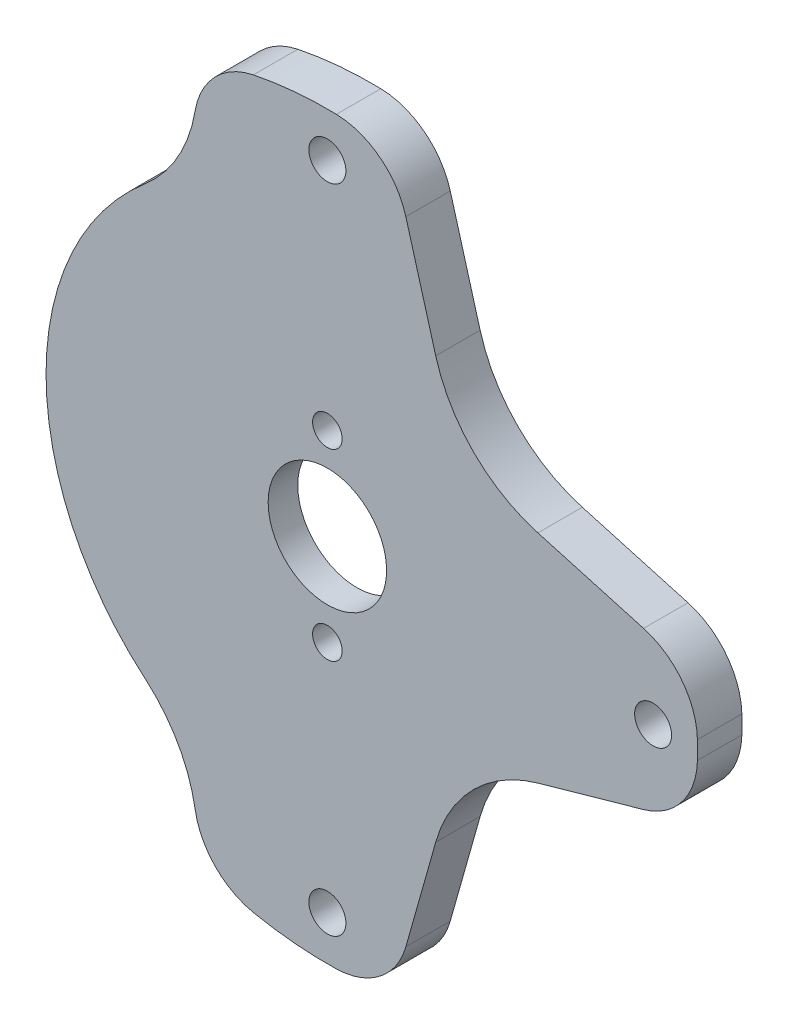
ISO-10303-21;
HEADER;
FILE_DESCRIPTION(('STEP AP214'),'2;1');
FILE_NAME('part.step','',(''),(''),'','','');
FILE_SCHEMA(('AUTOMOTIVE_DESIGN { 1 0 10303 214 1 1 1 1 }'));
ENDSEC;
DATA;
#1=APPLICATION_CONTEXT('core data for automotive mechanical design processes');
#2=APPLICATION_PROTOCOL_DEFINITION('international standard','automotive_design',2000,#1);
#3=PRODUCT_CONTEXT('',#1,'mechanical');
#4=PRODUCT('Part','Part','',(#3));
#5=PRODUCT_RELATED_PRODUCT_CATEGORY('part','',(#4));
#6=PRODUCT_DEFINITION_FORMATION('','',#4);
#7=PRODUCT_DEFINITION_CONTEXT('part definition',#1,'design');
#8=PRODUCT_DEFINITION('design','',#6,#7);
#9=PRODUCT_DEFINITION_SHAPE('','',#8);
#10=(LENGTH_UNIT() NAMED_UNIT(*) SI_UNIT(.MILLI.,.METRE.));
#11=(NAMED_UNIT(*) PLANE_ANGLE_UNIT() SI_UNIT($,.RADIAN.));
#12=(NAMED_UNIT(*) SI_UNIT($,.STERADIAN.) SOLID_ANGLE_UNIT());
#13=UNCERTAINTY_MEASURE_WITH_UNIT(LENGTH_MEASURE(1.E-05),#10,'distance_accuracy_value','');
#14=(GEOMETRIC_REPRESENTATION_CONTEXT(3) GLOBAL_UNCERTAINTY_ASSIGNED_CONTEXT((#13)) GLOBAL_UNIT_ASSIGNED_CONTEXT((#10,
#11,#12)) REPRESENTATION_CONTEXT('',''));
#15=CARTESIAN_POINT('',(0.,0.,0.));
#16=DIRECTION('',(0.,0.,1.));
#17=DIRECTION('',(1.,0.,0.));
#18=AXIS2_PLACEMENT_3D('',#15,#16,#17);
#19=CARTESIAN_POINT('',(0.,0.,3.));
#20=DIRECTION('',(0.,0.,-1.));
#21=DIRECTION('',(-1.,0.,0.));
#22=AXIS2_PLACEMENT_3D('',#19,#20,#21);
#23=CYLINDRICAL_SURFACE('',#22,25.);
#24=CARTESIAN_POINT('',(0.,0.,3.));
#25=DIRECTION('',(0.,0.,1.));
#26=DIRECTION('',(1.,0.,0.));
#27=AXIS2_PLACEMENT_3D('',#24,#25,#26);
#28=CIRCLE('',#27,25.);
#29=CARTESIAN_POINT('',(-5.,-24.4948974278318,3.));
#30=VERTEX_POINT('',#29);
#31=CARTESIAN_POINT('',(0.610003955992759,-24.9925567954476,3.));
#32=VERTEX_POINT('',#31);
#33=EDGE_CURVE('E206',#30,#32,#28,.T.);
#34=ORIENTED_EDGE('',*,*,#33,.F.);
#35=DIRECTION('',(0.,0.,-1.));
#36=VECTOR('',#35,1.);
#37=CARTESIAN_POINT('',(-5.,-24.4948974278318,3.));
#38=LINE('',#37,#36);
#39=CARTESIAN_POINT('',(-5.,-24.4948974278318,0.));
#40=VERTEX_POINT('',#39);
#41=EDGE_CURVE('E422',#30,#40,#38,.T.);
#42=ORIENTED_EDGE('',*,*,#41,.T.);
#43=CARTESIAN_POINT('',(0.,0.,0.));
#44=DIRECTION('',(0.,0.,1.));
#45=DIRECTION('',(1.,0.,0.));
#46=AXIS2_PLACEMENT_3D('',#43,#44,#45);
#47=CIRCLE('',#46,25.);
#48=CARTESIAN_POINT('',(0.610003955992759,-24.9925567954476,0.));
#49=VERTEX_POINT('',#48);
#50=EDGE_CURVE('E200',#40,#49,#47,.T.);
#51=ORIENTED_EDGE('',*,*,#50,.T.);
#52=DIRECTION('',(0.,0.,-1.));
#53=VECTOR('',#52,1.);
#54=CARTESIAN_POINT('',(0.610003955992759,-24.9925567954476,3.));
#55=LINE('',#54,#53);
#56=EDGE_CURVE('E418',#49,#32,#55,.F.);
#57=ORIENTED_EDGE('',*,*,#56,.T.);
#58=EDGE_LOOP('',(#34,#42,#51,#57));
#59=FACE_BOUND('',#58,.T.);
#60=ADVANCED_FACE('F43',(#59),#23,.T.);
#61=CARTESIAN_POINT('',(24.9925567954478,-0.610003955983885,3.));
#62=VERTEX_POINT('',#61);
#63=CARTESIAN_POINT('',(24.9925567954477,0.610003955988361,3.));
#64=VERTEX_POINT('',#63);
#65=EDGE_CURVE('E199',#62,#64,#28,.T.);
#66=ORIENTED_EDGE('',*,*,#65,.F.);
#67=DIRECTION('',(0.,0.,-1.));
#68=VECTOR('',#67,1.);
#69=CARTESIAN_POINT('',(24.9925567954478,-0.610003955983885,3.));
#70=LINE('',#69,#68);
#71=CARTESIAN_POINT('',(24.9925567954478,-0.610003955983885,0.));
#72=VERTEX_POINT('',#71);
#73=EDGE_CURVE('E329',#62,#72,#70,.T.);
#74=ORIENTED_EDGE('',*,*,#73,.T.);
#75=CARTESIAN_POINT('',(24.9925567954477,0.610003955988361,0.));
#76=VERTEX_POINT('',#75);
#77=EDGE_CURVE('E202',#72,#76,#47,.T.);
#78=ORIENTED_EDGE('',*,*,#77,.T.);
#79=DIRECTION('',(0.,0.,-1.));
#80=VECTOR('',#79,1.);
#81=CARTESIAN_POINT('',(24.9925567954477,0.610003955988361,3.));
#82=LINE('',#81,#80);
#83=EDGE_CURVE('E335',#76,#64,#82,.F.);
#84=ORIENTED_EDGE('',*,*,#83,.T.);
#85=EDGE_LOOP('',(#66,#74,#78,#84));
#86=FACE_BOUND('',#85,.T.);
#87=ADVANCED_FACE('F432',(#86),#23,.T.);
#88=CARTESIAN_POINT('',(0.,0.,3.));
#89=DIRECTION('',(0.,0.,1.));
#90=DIRECTION('',(1.,0.,0.));
#91=AXIS2_PLACEMENT_3D('',#88,#89,#90);
#92=PLANE('',#91);
#93=CARTESIAN_POINT('',(0.610003955988282,24.9925567954477,3.));
#94=VERTEX_POINT('',#93);
#95=CARTESIAN_POINT('',(-5.,24.4948974278318,3.));
#96=VERTEX_POINT('',#95);
#97=EDGE_CURVE('E189',#94,#96,#28,.T.);
#98=ORIENTED_EDGE('',*,*,#97,.T.);
#99=CARTESIAN_POINT('',(-4.,19.5959179422654,3.));
#100=DIRECTION('',(0.,0.,1.));
#101=DIRECTION('',(1.,0.,0.));
#102=AXIS2_PLACEMENT_3D('',#99,#100,#101);
#103=CIRCLE('',#102,5.);
#104=CARTESIAN_POINT('',(-8.93051419426742,20.4265982538941,3.));
#105=VERTEX_POINT('',#104);
#106=EDGE_CURVE('E403',#96,#105,#103,.T.);
#107=ORIENTED_EDGE('',*,*,#106,.T.);
#108=CARTESIAN_POINT('',(-18.7915425828023,22.0879588771514,3.));
#109=DIRECTION('',(0.,0.,1.));
#110=DIRECTION('',(1.,0.,0.));
#111=AXIS2_PLACEMENT_3D('',#108,#109,#110);
#112=CIRCLE('',#111,10.);
#113=CARTESIAN_POINT('',(-12.3117003128704,14.4714213333061,3.));
#114=VERTEX_POINT('',#113);
#115=EDGE_CURVE('E372',#105,#114,#112,.F.);
#116=ORIENTED_EDGE('',*,*,#115,.T.);
#117=CARTESIAN_POINT('',(0.,0.,3.));
#118=DIRECTION('',(0.,0.,1.));
#119=DIRECTION('',(1.,0.,0.));
#120=AXIS2_PLACEMENT_3D('',#117,#118,#119);
#121=CIRCLE('',#120,19.);
#122=CARTESIAN_POINT('',(-12.3117003128705,-14.471421333306,3.));
#123=VERTEX_POINT('',#122);
#124=EDGE_CURVE('E269',#123,#114,#121,.F.);
#125=ORIENTED_EDGE('',*,*,#124,.F.);
#126=CARTESIAN_POINT('',(-18.7915425828023,-22.0879588771513,3.));
#127=DIRECTION('',(0.,0.,1.));
#128=DIRECTION('',(1.,0.,0.));
#129=AXIS2_PLACEMENT_3D('',#126,#127,#128);
#130=CIRCLE('',#129,10.);
#131=CARTESIAN_POINT('',(-8.93051419426742,-20.4265982538941,3.));
#132=VERTEX_POINT('',#131);
#133=EDGE_CURVE('E366',#123,#132,#130,.F.);
#134=ORIENTED_EDGE('',*,*,#133,.T.);
#135=CARTESIAN_POINT('',(-4.,-19.5959179422654,3.));
#136=DIRECTION('',(0.,0.,1.));
#137=DIRECTION('',(1.,0.,0.));
#138=AXIS2_PLACEMENT_3D('',#135,#136,#137);
#139=CIRCLE('',#138,5.);
#140=EDGE_CURVE('E407',#132,#30,#139,.T.);
#141=ORIENTED_EDGE('',*,*,#140,.T.);
#142=ORIENTED_EDGE('',*,*,#33,.T.);
#143=CARTESIAN_POINT('',(0.488003164794207,-19.9940454363581,3.));
#144=DIRECTION('',(0.,0.,1.));
#145=DIRECTION('',(1.,0.,0.));
#146=AXIS2_PLACEMENT_3D('',#143,#144,#145);
#147=CIRCLE('',#146,5.);
#148=CARTESIAN_POINT('',(5.29930482273734,-21.3546983517901,3.));
#149=VERTEX_POINT('',#148);
#150=EDGE_CURVE('E434',#32,#149,#147,.T.);
#151=ORIENTED_EDGE('',*,*,#150,.T.);
#152=DIRECTION('',(-0.272130583086402,-0.962260331588627,0.));
#153=VECTOR('',#152,1.);
#154=CARTESIAN_POINT('',(10.4988157594116,-2.96910177062852,3.));
#155=LINE('',#154,#153);
#156=CARTESIAN_POINT('',(7.31739282425864,-14.2186903092749,3.));
#157=VERTEX_POINT('',#156);
#158=EDGE_CURVE('E283',#157,#149,#155,.T.);
#159=ORIENTED_EDGE('',*,*,#158,.F.);
#160=CARTESIAN_POINT('',(16.9399961401449,-16.9399961401389,3.));
#161=DIRECTION('',(0.,0.,1.));
#162=DIRECTION('',(1.,0.,0.));
#163=AXIS2_PLACEMENT_3D('',#160,#161,#162);
#164=CIRCLE('',#163,10.);
#165=CARTESIAN_POINT('',(14.2186903092775,-7.31739282425359,3.));
#166=VERTEX_POINT('',#165);
#167=EDGE_CURVE('E11',#157,#166,#164,.F.);
#168=ORIENTED_EDGE('',*,*,#167,.T.);
#169=DIRECTION('',(-0.962260331588531,-0.272130583086743,0.));
#170=VECTOR('',#169,1.);
#171=CARTESIAN_POINT('',(2.96910177063225,-10.4988157594105,3.));
#172=LINE('',#171,#170);
#173=CARTESIAN_POINT('',(21.354698351792,-5.29930482272976,3.));
#174=VERTEX_POINT('',#173);
#175=EDGE_CURVE('E279',#174,#166,#172,.T.);
#176=ORIENTED_EDGE('',*,*,#175,.F.);
#177=CARTESIAN_POINT('',(19.9940454363582,-0.488003164787108,3.));
#178=DIRECTION('',(0.,0.,1.));
#179=DIRECTION('',(1.,0.,0.));
#180=AXIS2_PLACEMENT_3D('',#177,#178,#179);
#181=CIRCLE('',#180,5.);
#182=EDGE_CURVE('E326',#174,#62,#181,.T.);
#183=ORIENTED_EDGE('',*,*,#182,.T.);
#184=ORIENTED_EDGE('',*,*,#65,.T.);
#185=CARTESIAN_POINT('',(19.9940454363582,0.488003164790689,3.));
#186=DIRECTION('',(0.,0.,1.));
#187=DIRECTION('',(1.,0.,0.));
#188=AXIS2_PLACEMENT_3D('',#185,#186,#187);
#189=CIRCLE('',#188,5.);
#190=CARTESIAN_POINT('',(21.354698351791,5.29930482273358,3.));
#191=VERTEX_POINT('',#190);
#192=EDGE_CURVE('E401',#64,#191,#189,.T.);
#193=ORIENTED_EDGE('',*,*,#192,.T.);
#194=DIRECTION('',(0.962260331588579,-0.272130583086571,0.));
#195=VECTOR('',#194,1.);
#196=CARTESIAN_POINT('',(2.96910177063037,10.4988157594111,3.));
#197=LINE('',#196,#195);
#198=CARTESIAN_POINT('',(14.2186903092762,7.31739282425614,3.));
#199=VERTEX_POINT('',#198);
#200=EDGE_CURVE('E290',#199,#191,#197,.T.);
#201=ORIENTED_EDGE('',*,*,#200,.F.);
#202=CARTESIAN_POINT('',(16.9399961401419,16.9399961401419,3.));
#203=DIRECTION('',(0.,0.,1.));
#204=DIRECTION('',(1.,0.,0.));
#205=AXIS2_PLACEMENT_3D('',#202,#203,#204);
#206=CIRCLE('',#205,10.);
#207=CARTESIAN_POINT('',(7.31739282425609,14.2186903092762,3.));
#208=VERTEX_POINT('',#207);
#209=EDGE_CURVE('E378',#199,#208,#206,.F.);
#210=ORIENTED_EDGE('',*,*,#209,.T.);
#211=DIRECTION('',(0.272130583086574,-0.962260331588579,0.));
#212=VECTOR('',#211,1.);
#213=CARTESIAN_POINT('',(10.4988157594111,2.9691017706304,3.));
#214=LINE('',#213,#212);
#215=CARTESIAN_POINT('',(5.29930482273352,21.354698351791,3.));
#216=VERTEX_POINT('',#215);
#217=EDGE_CURVE('E286',#216,#208,#214,.T.);
#218=ORIENTED_EDGE('',*,*,#217,.F.);
#219=CARTESIAN_POINT('',(0.488003164790625,19.9940454363582,3.));
#220=DIRECTION('',(0.,0.,1.));
#221=DIRECTION('',(1.,0.,0.));
#222=AXIS2_PLACEMENT_3D('',#219,#220,#221);
#223=CIRCLE('',#222,5.);
#224=EDGE_CURVE('E439',#216,#94,#223,.T.);
#225=ORIENTED_EDGE('',*,*,#224,.T.);
#226=EDGE_LOOP('',(#98,#107,#116,#125,#134,#141,#142,#151,#159,#168,#176,#183,#184,#193,#201,
#210,#218,#225));
#227=FACE_BOUND('',#226,.T.);
#228=CARTESIAN_POINT('',(0.,6.2,3.));
#229=DIRECTION('',(0.,0.,-1.));
#230=DIRECTION('',(-1.,0.,0.));
#231=AXIS2_PLACEMENT_3D('',#228,#229,#230);
#232=CIRCLE('',#231,1.);
#233=CARTESIAN_POINT('',(-1.,6.2,3.));
#234=VERTEX_POINT('',#233);
#235=EDGE_CURVE('E263',#234,#234,#232,.T.);
#236=ORIENTED_EDGE('',*,*,#235,.T.);
#237=EDGE_LOOP('',(#236));
#238=FACE_BOUND('',#237,.T.);
#239=CARTESIAN_POINT('',(0.,0.,3.));
#240=DIRECTION('',(0.,0.,-1.));
#241=DIRECTION('',(-1.,0.,0.));
#242=AXIS2_PLACEMENT_3D('',#239,#240,#241);
#243=CIRCLE('',#242,4.);
#244=CARTESIAN_POINT('',(-4.,0.,3.));
#245=VERTEX_POINT('',#244);
#246=EDGE_CURVE('E268',#245,#245,#243,.T.);
#247=ORIENTED_EDGE('',*,*,#246,.T.);
#248=EDGE_LOOP('',(#247));
#249=FACE_BOUND('',#248,.T.);
#250=CARTESIAN_POINT('',(0.,-6.2,3.));
#251=DIRECTION('',(0.,0.,-1.));
#252=DIRECTION('',(-1.,0.,0.));
#253=AXIS2_PLACEMENT_3D('',#250,#251,#252);
#254=CIRCLE('',#253,1.);
#255=CARTESIAN_POINT('',(-1.,-6.2,3.));
#256=VERTEX_POINT('',#255);
#257=EDGE_CURVE('E264',#256,#256,#254,.T.);
#258=ORIENTED_EDGE('',*,*,#257,.T.);
#259=EDGE_LOOP('',(#258));
#260=FACE_BOUND('',#259,.T.);
#261=CARTESIAN_POINT('',(22.,-2.26077837006677E-12,3.));
#262=DIRECTION('',(0.,0.,1.));
#263=DIRECTION('',(1.,0.,0.));
#264=AXIS2_PLACEMENT_3D('',#261,#262,#263);
#265=CIRCLE('',#264,1.25);
#266=CARTESIAN_POINT('',(23.25,-2.26077837006677E-12,3.));
#267=VERTEX_POINT('',#266);
#268=EDGE_CURVE('E225',#267,#267,#265,.T.);
#269=ORIENTED_EDGE('',*,*,#268,.F.);
#270=EDGE_LOOP('',(#269));
#271=FACE_BOUND('',#270,.T.);
#272=CARTESIAN_POINT('',(0.,22.,3.));
#273=DIRECTION('',(0.,0.,1.));
#274=DIRECTION('',(1.,0.,0.));
#275=AXIS2_PLACEMENT_3D('',#272,#273,#274);
#276=CIRCLE('',#275,1.25);
#277=CARTESIAN_POINT('',(1.25,22.,3.));
#278=VERTEX_POINT('',#277);
#279=EDGE_CURVE('E211',#278,#278,#276,.T.);
#280=ORIENTED_EDGE('',*,*,#279,.F.);
#281=EDGE_LOOP('',(#280));
#282=FACE_BOUND('',#281,.T.);
#283=CARTESIAN_POINT('',(-4.52068937839556E-12,-22.,3.));
#284=DIRECTION('',(0.,0.,1.));
#285=DIRECTION('',(1.,0.,0.));
#286=AXIS2_PLACEMENT_3D('',#283,#284,#285);
#287=CIRCLE('',#286,1.25);
#288=CARTESIAN_POINT('',(1.24999999999548,-22.,3.));
#289=VERTEX_POINT('',#288);
#290=EDGE_CURVE('E232',#289,#289,#287,.T.);
#291=ORIENTED_EDGE('',*,*,#290,.F.);
#292=EDGE_LOOP('',(#291));
#293=FACE_BOUND('',#292,.T.);
#294=ADVANCED_FACE('F385',(#227,#238,#249,#260,#271,#282,#293),#92,.T.);
#295=CARTESIAN_POINT('',(0.,0.,0.));
#296=DIRECTION('',(0.,0.,1.));
#297=DIRECTION('',(1.,0.,0.));
#298=AXIS2_PLACEMENT_3D('',#295,#296,#297);
#299=PLANE('',#298);
#300=CARTESIAN_POINT('',(0.,0.,0.));
#301=DIRECTION('',(0.,0.,-1.));
#302=DIRECTION('',(-1.,0.,0.));
#303=AXIS2_PLACEMENT_3D('',#300,#301,#302);
#304=CIRCLE('',#303,10.5);
#305=CARTESIAN_POINT('',(-10.5,0.,0.));
#306=VERTEX_POINT('',#305);
#307=EDGE_CURVE('E244',#306,#306,#304,.T.);
#308=ORIENTED_EDGE('',*,*,#307,.F.);
#309=EDGE_LOOP('',(#308));
#310=FACE_BOUND('',#309,.T.);
#311=CARTESIAN_POINT('',(0.,0.,0.));
#312=DIRECTION('',(0.,0.,1.));
#313=DIRECTION('',(-1.,0.,0.));
#314=AXIS2_PLACEMENT_3D('',#311,#312,#313);
#315=CIRCLE('',#314,19.);
#316=CARTESIAN_POINT('',(-12.3117003128704,14.4714213333061,0.));
#317=VERTEX_POINT('',#316);
#318=CARTESIAN_POINT('',(-12.3117003128705,-14.471421333306,0.));
#319=VERTEX_POINT('',#318);
#320=EDGE_CURVE('E301',#317,#319,#315,.T.);
#321=ORIENTED_EDGE('',*,*,#320,.F.);
#322=CARTESIAN_POINT('',(-18.7915425828023,22.0879588771514,0.));
#323=DIRECTION('',(0.,0.,1.));
#324=DIRECTION('',(1.,0.,0.));
#325=AXIS2_PLACEMENT_3D('',#322,#323,#324);
#326=CIRCLE('',#325,10.);
#327=CARTESIAN_POINT('',(-8.93051419426742,20.4265982538941,0.));
#328=VERTEX_POINT('',#327);
#329=EDGE_CURVE('E369',#317,#328,#326,.T.);
#330=ORIENTED_EDGE('',*,*,#329,.T.);
#331=CARTESIAN_POINT('',(-4.,19.5959179422654,0.));
#332=DIRECTION('',(0.,0.,1.));
#333=DIRECTION('',(1.,0.,0.));
#334=AXIS2_PLACEMENT_3D('',#331,#332,#333);
#335=CIRCLE('',#334,5.);
#336=CARTESIAN_POINT('',(-5.,24.4948974278318,0.));
#337=VERTEX_POINT('',#336);
#338=EDGE_CURVE('E197',#328,#337,#335,.F.);
#339=ORIENTED_EDGE('',*,*,#338,.T.);
#340=CARTESIAN_POINT('',(0.610003955988282,24.9925567954477,0.));
#341=VERTEX_POINT('',#340);
#342=EDGE_CURVE('E186',#341,#337,#47,.T.);
#343=ORIENTED_EDGE('',*,*,#342,.F.);
#344=CARTESIAN_POINT('',(0.488003164790625,19.9940454363582,0.));
#345=DIRECTION('',(0.,0.,1.));
#346=DIRECTION('',(1.,0.,0.));
#347=AXIS2_PLACEMENT_3D('',#344,#345,#346);
#348=CIRCLE('',#347,5.);
#349=CARTESIAN_POINT('',(5.29930482273352,21.354698351791,0.));
#350=VERTEX_POINT('',#349);
#351=EDGE_CURVE('E169',#341,#350,#348,.F.);
#352=ORIENTED_EDGE('',*,*,#351,.T.);
#353=DIRECTION('',(-0.272130583086574,0.962260331588579,0.));
#354=VECTOR('',#353,1.);
#355=CARTESIAN_POINT('',(4.37763584190016,24.6137421867483,0.));
#356=LINE('',#355,#354);
#357=CARTESIAN_POINT('',(7.31739282425609,14.2186903092762,0.));
#358=VERTEX_POINT('',#357);
#359=EDGE_CURVE('E293',#358,#350,#356,.T.);
#360=ORIENTED_EDGE('',*,*,#359,.F.);
#361=CARTESIAN_POINT('',(16.9399961401419,16.9399961401419,0.));
#362=DIRECTION('',(0.,0.,1.));
#363=DIRECTION('',(1.,0.,0.));
#364=AXIS2_PLACEMENT_3D('',#361,#362,#363);
#365=CIRCLE('',#364,10.);
#366=CARTESIAN_POINT('',(14.2186903092762,7.31739282425614,0.));
#367=VERTEX_POINT('',#366);
#368=EDGE_CURVE('E375',#358,#367,#365,.T.);
#369=ORIENTED_EDGE('',*,*,#368,.T.);
#370=DIRECTION('',(-0.962260331588579,0.272130583086571,0.));
#371=VECTOR('',#370,1.);
#372=CARTESIAN_POINT('',(24.6137421867483,4.37763584190023,0.));
#373=LINE('',#372,#371);
#374=CARTESIAN_POINT('',(21.354698351791,5.29930482273359,0.));
#375=VERTEX_POINT('',#374);
#376=EDGE_CURVE('E296',#375,#367,#373,.T.);
#377=ORIENTED_EDGE('',*,*,#376,.F.);
#378=CARTESIAN_POINT('',(19.9940454363582,0.488003164790689,0.));
#379=DIRECTION('',(0.,0.,1.));
#380=DIRECTION('',(1.,0.,0.));
#381=AXIS2_PLACEMENT_3D('',#378,#379,#380);
#382=CIRCLE('',#381,5.);
#383=EDGE_CURVE('E322',#375,#76,#382,.F.);
#384=ORIENTED_EDGE('',*,*,#383,.T.);
#385=ORIENTED_EDGE('',*,*,#77,.F.);
#386=CARTESIAN_POINT('',(19.9940454363582,-0.488003164787108,0.));
#387=DIRECTION('',(0.,0.,1.));
#388=DIRECTION('',(1.,0.,0.));
#389=AXIS2_PLACEMENT_3D('',#386,#387,#388);
#390=CIRCLE('',#389,5.);
#391=CARTESIAN_POINT('',(21.354698351792,-5.29930482272976,0.));
#392=VERTEX_POINT('',#391);
#393=EDGE_CURVE('E318',#72,#392,#390,.F.);
#394=ORIENTED_EDGE('',*,*,#393,.T.);
#395=DIRECTION('',(0.962260331588531,0.272130583086743,0.));
#396=VECTOR('',#395,1.);
#397=CARTESIAN_POINT('',(24.613742186749,-4.37763584189583,0.));
#398=LINE('',#397,#396);
#399=CARTESIAN_POINT('',(14.2186903092775,-7.31739282425359,0.));
#400=VERTEX_POINT('',#399);
#401=EDGE_CURVE('E305',#400,#392,#398,.T.);
#402=ORIENTED_EDGE('',*,*,#401,.F.);
#403=CARTESIAN_POINT('',(16.9399961401449,-16.9399961401389,0.));
#404=DIRECTION('',(0.,0.,1.));
#405=DIRECTION('',(1.,0.,0.));
#406=AXIS2_PLACEMENT_3D('',#403,#404,#405);
#407=CIRCLE('',#406,10.);
#408=CARTESIAN_POINT('',(7.31739282425864,-14.2186903092749,0.));
#409=VERTEX_POINT('',#408);
#410=EDGE_CURVE('E52',#400,#409,#407,.T.);
#411=ORIENTED_EDGE('',*,*,#410,.T.);
#412=DIRECTION('',(0.272130583086402,0.962260331588627,0.));
#413=VECTOR('',#412,1.);
#414=CARTESIAN_POINT('',(4.37763584190456,-24.6137421867475,0.));
#415=LINE('',#414,#413);
#416=CARTESIAN_POINT('',(5.29930482273734,-21.3546983517901,0.));
#417=VERTEX_POINT('',#416);
#418=EDGE_CURVE('E300',#417,#409,#415,.T.);
#419=ORIENTED_EDGE('',*,*,#418,.F.);
#420=CARTESIAN_POINT('',(0.488003164794207,-19.9940454363581,0.));
#421=DIRECTION('',(0.,0.,1.));
#422=DIRECTION('',(1.,0.,0.));
#423=AXIS2_PLACEMENT_3D('',#420,#421,#422);
#424=CIRCLE('',#423,5.);
#425=EDGE_CURVE('E179',#417,#49,#424,.F.);
#426=ORIENTED_EDGE('',*,*,#425,.T.);
#427=ORIENTED_EDGE('',*,*,#50,.F.);
#428=CARTESIAN_POINT('',(-4.,-19.5959179422654,0.));
#429=DIRECTION('',(0.,0.,1.));
#430=DIRECTION('',(1.,0.,0.));
#431=AXIS2_PLACEMENT_3D('',#428,#429,#430);
#432=CIRCLE('',#431,5.);
#433=CARTESIAN_POINT('',(-8.93051419426742,-20.4265982538941,0.));
#434=VERTEX_POINT('',#433);
#435=EDGE_CURVE('E178',#40,#434,#432,.F.);
#436=ORIENTED_EDGE('',*,*,#435,.T.);
#437=CARTESIAN_POINT('',(-18.7915425828023,-22.0879588771513,0.));
#438=DIRECTION('',(0.,0.,1.));
#439=DIRECTION('',(1.,0.,0.));
#440=AXIS2_PLACEMENT_3D('',#437,#438,#439);
#441=CIRCLE('',#440,10.);
#442=EDGE_CURVE('E363',#434,#319,#441,.T.);
#443=ORIENTED_EDGE('',*,*,#442,.T.);
#444=EDGE_LOOP('',(#321,#330,#339,#343,#352,#360,#369,#377,#384,#385,#394,#402,#411,#419,#426,
#427,#436,#443));
#445=FACE_BOUND('',#444,.T.);
#446=CARTESIAN_POINT('',(0.,22.,0.));
#447=DIRECTION('',(0.,0.,1.));
#448=DIRECTION('',(1.,0.,0.));
#449=AXIS2_PLACEMENT_3D('',#446,#447,#448);
#450=CIRCLE('',#449,1.25);
#451=CARTESIAN_POINT('',(1.25,22.,0.));
#452=VERTEX_POINT('',#451);
#453=EDGE_CURVE('E219',#452,#452,#450,.T.);
#454=ORIENTED_EDGE('',*,*,#453,.T.);
#455=EDGE_LOOP('',(#454));
#456=FACE_BOUND('',#455,.T.);
#457=CARTESIAN_POINT('',(22.,-2.26077837006677E-12,0.));
#458=DIRECTION('',(0.,0.,1.));
#459=DIRECTION('',(1.,0.,0.));
#460=AXIS2_PLACEMENT_3D('',#457,#458,#459);
#461=CIRCLE('',#460,1.25);
#462=CARTESIAN_POINT('',(23.25,-2.26077837006677E-12,0.));
#463=VERTEX_POINT('',#462);
#464=EDGE_CURVE('E228',#463,#463,#461,.T.);
#465=ORIENTED_EDGE('',*,*,#464,.T.);
#466=EDGE_LOOP('',(#465));
#467=FACE_BOUND('',#466,.T.);
#468=CARTESIAN_POINT('',(-4.52068937839556E-12,-22.,0.));
#469=DIRECTION('',(0.,0.,1.));
#470=DIRECTION('',(1.,0.,0.));
#471=AXIS2_PLACEMENT_3D('',#468,#469,#470);
#472=CIRCLE('',#471,1.25);
#473=CARTESIAN_POINT('',(1.24999999999548,-22.,0.));
#474=VERTEX_POINT('',#473);
#475=EDGE_CURVE('E236',#474,#474,#472,.T.);
#476=ORIENTED_EDGE('',*,*,#475,.T.);
#477=EDGE_LOOP('',(#476));
#478=FACE_BOUND('',#477,.T.);
#479=ADVANCED_FACE('F194',(#310,#445,#456,#467,#478),#299,.F.);
#480=ORIENTED_EDGE('',*,*,#342,.T.);
#481=DIRECTION('',(0.,0.,-1.));
#482=VECTOR('',#481,1.);
#483=CARTESIAN_POINT('',(-5.,24.4948974278318,3.));
#484=LINE('',#483,#482);
#485=EDGE_CURVE('E191',#337,#96,#484,.F.);
#486=ORIENTED_EDGE('',*,*,#485,.T.);
#487=ORIENTED_EDGE('',*,*,#97,.F.);
#488=DIRECTION('',(0.,0.,-1.));
#489=VECTOR('',#488,1.);
#490=CARTESIAN_POINT('',(0.610003955988282,24.9925567954477,3.));
#491=LINE('',#490,#489);
#492=EDGE_CURVE('E173',#94,#341,#491,.T.);
#493=ORIENTED_EDGE('',*,*,#492,.T.);
#494=EDGE_LOOP('',(#480,#486,#487,#493));
#495=FACE_BOUND('',#494,.T.);
#496=ADVANCED_FACE('F184',(#495),#23,.T.);
#497=CARTESIAN_POINT('',(0.,22.,3.));
#498=DIRECTION('',(0.,0.,-1.));
#499=DIRECTION('',(-1.,0.,0.));
#500=AXIS2_PLACEMENT_3D('',#497,#498,#499);
#501=CYLINDRICAL_SURFACE('',#500,1.25);
#502=ORIENTED_EDGE('',*,*,#279,.T.);
#503=EDGE_LOOP('',(#502));
#504=FACE_BOUND('',#503,.T.);
#505=ORIENTED_EDGE('',*,*,#453,.F.);
#506=EDGE_LOOP('',(#505));
#507=FACE_BOUND('',#506,.T.);
#508=ADVANCED_FACE('F478',(#504,#507),#501,.F.);
#509=CARTESIAN_POINT('',(22.,-2.26077837006677E-12,3.));
#510=DIRECTION('',(0.,0.,-1.));
#511=DIRECTION('',(-1.,0.,0.));
#512=AXIS2_PLACEMENT_3D('',#509,#510,#511);
#513=CYLINDRICAL_SURFACE('',#512,1.25);
#514=ORIENTED_EDGE('',*,*,#268,.T.);
#515=EDGE_LOOP('',(#514));
#516=FACE_BOUND('',#515,.T.);
#517=ORIENTED_EDGE('',*,*,#464,.F.);
#518=EDGE_LOOP('',(#517));
#519=FACE_BOUND('',#518,.T.);
#520=ADVANCED_FACE('F483',(#516,#519),#513,.F.);
#521=CARTESIAN_POINT('',(-4.52068937839556E-12,-22.,3.));
#522=DIRECTION('',(0.,0.,-1.));
#523=DIRECTION('',(-1.,0.,0.));
#524=AXIS2_PLACEMENT_3D('',#521,#522,#523);
#525=CYLINDRICAL_SURFACE('',#524,1.25);
#526=ORIENTED_EDGE('',*,*,#290,.T.);
#527=EDGE_LOOP('',(#526));
#528=FACE_BOUND('',#527,.T.);
#529=ORIENTED_EDGE('',*,*,#475,.F.);
#530=EDGE_LOOP('',(#529));
#531=FACE_BOUND('',#530,.T.);
#532=ADVANCED_FACE('F494',(#528,#531),#525,.F.);
#533=CARTESIAN_POINT('',(0.,0.,1.));
#534=DIRECTION('',(0.,0.,-1.));
#535=DIRECTION('',(-1.,0.,0.));
#536=AXIS2_PLACEMENT_3D('',#533,#534,#535);
#537=CYLINDRICAL_SURFACE('',#536,10.5);
#538=CARTESIAN_POINT('',(0.,0.,1.));
#539=DIRECTION('',(0.,0.,-1.));
#540=DIRECTION('',(-1.,0.,0.));
#541=AXIS2_PLACEMENT_3D('',#538,#539,#540);
#542=CIRCLE('',#541,10.5);
#543=CARTESIAN_POINT('',(-10.5,0.,1.));
#544=VERTEX_POINT('',#543);
#545=EDGE_CURVE('E240',#544,#544,#542,.T.);
#546=ORIENTED_EDGE('',*,*,#545,.F.);
#547=EDGE_LOOP('',(#546));
#548=FACE_BOUND('',#547,.T.);
#549=ORIENTED_EDGE('',*,*,#307,.T.);
#550=EDGE_LOOP('',(#549));
#551=FACE_BOUND('',#550,.T.);
#552=ADVANCED_FACE('F498',(#548,#551),#537,.F.);
#553=CARTESIAN_POINT('',(0.,0.,1.));
#554=DIRECTION('',(0.,0.,-1.));
#555=DIRECTION('',(-1.,0.,0.));
#556=AXIS2_PLACEMENT_3D('',#553,#554,#555);
#557=PLANE('',#556);
#558=CARTESIAN_POINT('',(0.,-6.2,1.));
#559=DIRECTION('',(0.,0.,-1.));
#560=DIRECTION('',(-1.,0.,0.));
#561=AXIS2_PLACEMENT_3D('',#558,#559,#560);
#562=CIRCLE('',#561,1.);
#563=CARTESIAN_POINT('',(-1.,-6.2,1.));
#564=VERTEX_POINT('',#563);
#565=EDGE_CURVE('E259',#564,#564,#562,.T.);
#566=ORIENTED_EDGE('',*,*,#565,.F.);
#567=EDGE_LOOP('',(#566));
#568=FACE_BOUND('',#567,.T.);
#569=CARTESIAN_POINT('',(0.,6.2,1.));
#570=DIRECTION('',(0.,0.,-1.));
#571=DIRECTION('',(-1.,0.,0.));
#572=AXIS2_PLACEMENT_3D('',#569,#570,#571);
#573=CIRCLE('',#572,1.);
#574=CARTESIAN_POINT('',(-1.,6.2,1.));
#575=VERTEX_POINT('',#574);
#576=EDGE_CURVE('E248',#575,#575,#573,.T.);
#577=ORIENTED_EDGE('',*,*,#576,.F.);
#578=EDGE_LOOP('',(#577));
#579=FACE_BOUND('',#578,.T.);
#580=CARTESIAN_POINT('',(0.,0.,1.));
#581=DIRECTION('',(0.,0.,-1.));
#582=DIRECTION('',(-1.,0.,0.));
#583=AXIS2_PLACEMENT_3D('',#580,#581,#582);
#584=CIRCLE('',#583,4.);
#585=CARTESIAN_POINT('',(-4.,0.,1.));
#586=VERTEX_POINT('',#585);
#587=EDGE_CURVE('E255',#586,#586,#584,.T.);
#588=ORIENTED_EDGE('',*,*,#587,.F.);
#589=EDGE_LOOP('',(#588));
#590=FACE_BOUND('',#589,.T.);
#591=ORIENTED_EDGE('',*,*,#545,.T.);
#592=EDGE_LOOP('',(#591));
#593=FACE_BOUND('',#592,.T.);
#594=ADVANCED_FACE('F502',(#568,#579,#590,#593),#557,.T.);
#595=CARTESIAN_POINT('',(0.,-6.2,3.));
#596=DIRECTION('',(0.,0.,-1.));
#597=DIRECTION('',(-1.,0.,0.));
#598=AXIS2_PLACEMENT_3D('',#595,#596,#597);
#599=CYLINDRICAL_SURFACE('',#598,1.);
#600=ORIENTED_EDGE('',*,*,#565,.T.);
#601=EDGE_LOOP('',(#600));
#602=FACE_BOUND('',#601,.T.);
#603=ORIENTED_EDGE('',*,*,#257,.F.);
#604=EDGE_LOOP('',(#603));
#605=FACE_BOUND('',#604,.T.);
#606=ADVANCED_FACE('F506',(#602,#605),#599,.F.);
#607=CARTESIAN_POINT('',(0.,0.,3.));
#608=DIRECTION('',(0.,0.,-1.));
#609=DIRECTION('',(-1.,0.,0.));
#610=AXIS2_PLACEMENT_3D('',#607,#608,#609);
#611=CYLINDRICAL_SURFACE('',#610,4.);
#612=ORIENTED_EDGE('',*,*,#587,.T.);
#613=EDGE_LOOP('',(#612));
#614=FACE_BOUND('',#613,.T.);
#615=ORIENTED_EDGE('',*,*,#246,.F.);
#616=EDGE_LOOP('',(#615));
#617=FACE_BOUND('',#616,.T.);
#618=ADVANCED_FACE('F510',(#614,#617),#611,.F.);
#619=CARTESIAN_POINT('',(0.,6.2,3.));
#620=DIRECTION('',(0.,0.,-1.));
#621=DIRECTION('',(-1.,0.,0.));
#622=AXIS2_PLACEMENT_3D('',#619,#620,#621);
#623=CYLINDRICAL_SURFACE('',#622,1.);
#624=ORIENTED_EDGE('',*,*,#576,.T.);
#625=EDGE_LOOP('',(#624));
#626=FACE_BOUND('',#625,.T.);
#627=ORIENTED_EDGE('',*,*,#235,.F.);
#628=EDGE_LOOP('',(#627));
#629=FACE_BOUND('',#628,.T.);
#630=ADVANCED_FACE('F514',(#626,#629),#623,.F.);
#631=CARTESIAN_POINT('',(4.37763584190016,24.6137421867483,10.));
#632=DIRECTION('',(-0.962260331588579,-0.272130583086574,0.));
#633=DIRECTION('',(0.272130583086574,-0.962260331588579,0.));
#634=AXIS2_PLACEMENT_3D('',#631,#632,#633);
#635=PLANE('',#634);
#636=ORIENTED_EDGE('',*,*,#217,.T.);
#637=DIRECTION('',(0.,0.,-1.));
#638=VECTOR('',#637,1.);
#639=CARTESIAN_POINT('',(7.31739282425609,14.2186903092762,0.));
#640=LINE('',#639,#638);
#641=EDGE_CURVE('E352',#208,#358,#640,.T.);
#642=ORIENTED_EDGE('',*,*,#641,.T.);
#643=ORIENTED_EDGE('',*,*,#359,.T.);
#644=DIRECTION('',(0.,0.,-1.));
#645=VECTOR('',#644,1.);
#646=CARTESIAN_POINT('',(5.29930482273352,21.354698351791,10.));
#647=LINE('',#646,#645);
#648=EDGE_CURVE('E174',#350,#216,#647,.F.);
#649=ORIENTED_EDGE('',*,*,#648,.T.);
#650=EDGE_LOOP('',(#636,#642,#643,#649));
#651=FACE_BOUND('',#650,.T.);
#652=ADVANCED_FACE('F392',(#651),#635,.F.);
#653=CARTESIAN_POINT('',(24.6137421867483,4.37763584190023,10.));
#654=DIRECTION('',(-0.272130583086571,-0.962260331588579,0.));
#655=DIRECTION('',(0.962260331588579,-0.272130583086571,0.));
#656=AXIS2_PLACEMENT_3D('',#653,#654,#655);
#657=PLANE('',#656);
#658=ORIENTED_EDGE('',*,*,#376,.T.);
#659=DIRECTION('',(0.,0.,-1.));
#660=VECTOR('',#659,1.);
#661=CARTESIAN_POINT('',(14.2186903092762,7.31739282425614,3.));
#662=LINE('',#661,#660);
#663=EDGE_CURVE('E356',#367,#199,#662,.F.);
#664=ORIENTED_EDGE('',*,*,#663,.T.);
#665=ORIENTED_EDGE('',*,*,#200,.T.);
#666=DIRECTION('',(0.,0.,-1.));
#667=VECTOR('',#666,1.);
#668=CARTESIAN_POINT('',(21.354698351791,5.29930482273359,10.));
#669=LINE('',#668,#667);
#670=EDGE_CURVE('E328',#191,#375,#669,.T.);
#671=ORIENTED_EDGE('',*,*,#670,.T.);
#672=EDGE_LOOP('',(#658,#664,#665,#671));
#673=FACE_BOUND('',#672,.T.);
#674=ADVANCED_FACE('F397',(#673),#657,.F.);
#675=CARTESIAN_POINT('',(24.613742186749,-4.37763584189583,10.));
#676=DIRECTION('',(-0.272130583086743,0.962260331588531,0.));
#677=DIRECTION('',(-0.962260331588531,-0.272130583086743,0.));
#678=AXIS2_PLACEMENT_3D('',#675,#676,#677);
#679=PLANE('',#678);
#680=ORIENTED_EDGE('',*,*,#175,.T.);
#681=DIRECTION('',(0.,0.,-1.));
#682=VECTOR('',#681,1.);
#683=CARTESIAN_POINT('',(14.2186903092775,-7.31739282425359,0.));
#684=LINE('',#683,#682);
#685=EDGE_CURVE('E317',#166,#400,#684,.T.);
#686=ORIENTED_EDGE('',*,*,#685,.T.);
#687=ORIENTED_EDGE('',*,*,#401,.T.);
#688=DIRECTION('',(0.,0.,-1.));
#689=VECTOR('',#688,1.);
#690=CARTESIAN_POINT('',(21.354698351792,-5.29930482272976,10.));
#691=LINE('',#690,#689);
#692=EDGE_CURVE('E314',#392,#174,#691,.F.);
#693=ORIENTED_EDGE('',*,*,#692,.T.);
#694=EDGE_LOOP('',(#680,#686,#687,#693));
#695=FACE_BOUND('',#694,.T.);
#696=ADVANCED_FACE('F312',(#695),#679,.F.);
#697=CARTESIAN_POINT('',(4.37763584190456,-24.6137421867475,10.));
#698=DIRECTION('',(-0.962260331588627,0.272130583086402,0.));
#699=DIRECTION('',(-0.272130583086402,-0.962260331588627,0.));
#700=AXIS2_PLACEMENT_3D('',#697,#698,#699);
#701=PLANE('',#700);
#702=ORIENTED_EDGE('',*,*,#418,.T.);
#703=DIRECTION('',(0.,0.,-1.));
#704=VECTOR('',#703,1.);
#705=CARTESIAN_POINT('',(7.31739282425864,-14.2186903092749,3.));
#706=LINE('',#705,#704);
#707=EDGE_CURVE('E65',#409,#157,#706,.F.);
#708=ORIENTED_EDGE('',*,*,#707,.T.);
#709=ORIENTED_EDGE('',*,*,#158,.T.);
#710=DIRECTION('',(0.,0.,-1.));
#711=VECTOR('',#710,1.);
#712=CARTESIAN_POINT('',(5.29930482273734,-21.3546983517901,10.));
#713=LINE('',#712,#711);
#714=EDGE_CURVE('E428',#149,#417,#713,.T.);
#715=ORIENTED_EDGE('',*,*,#714,.T.);
#716=EDGE_LOOP('',(#702,#708,#709,#715));
#717=FACE_BOUND('',#716,.T.);
#718=ADVANCED_FACE('F527',(#717),#701,.F.);
#719=CARTESIAN_POINT('',(0.,0.,10.));
#720=DIRECTION('',(0.,0.,-1.));
#721=DIRECTION('',(-1.,0.,0.));
#722=AXIS2_PLACEMENT_3D('',#719,#720,#721);
#723=CYLINDRICAL_SURFACE('',#722,19.);
#724=ORIENTED_EDGE('',*,*,#320,.T.);
#725=DIRECTION('',(0.,0.,-1.));
#726=VECTOR('',#725,1.);
#727=CARTESIAN_POINT('',(-12.3117003128705,-14.4714213333061,10.));
#728=LINE('',#727,#726);
#729=EDGE_CURVE('E346',#319,#123,#728,.F.);
#730=ORIENTED_EDGE('',*,*,#729,.T.);
#731=ORIENTED_EDGE('',*,*,#124,.T.);
#732=DIRECTION('',(0.,0.,-1.));
#733=VECTOR('',#732,1.);
#734=CARTESIAN_POINT('',(-12.3117003128705,14.4714213333061,10.));
#735=LINE('',#734,#733);
#736=EDGE_CURVE('E342',#114,#317,#735,.T.);
#737=ORIENTED_EDGE('',*,*,#736,.T.);
#738=EDGE_LOOP('',(#724,#730,#731,#737));
#739=FACE_BOUND('',#738,.T.);
#740=ADVANCED_FACE('F523',(#739),#723,.T.);
#741=CARTESIAN_POINT('',(-4.,19.5959179422654,3.));
#742=DIRECTION('',(0.,0.,-1.));
#743=DIRECTION('',(-1.,0.,0.));
#744=AXIS2_PLACEMENT_3D('',#741,#742,#743);
#745=CYLINDRICAL_SURFACE('',#744,5.);
#746=ORIENTED_EDGE('',*,*,#338,.F.);
#747=DIRECTION('',(0.,0.,-1.));
#748=VECTOR('',#747,1.);
#749=CARTESIAN_POINT('',(-8.93051419426742,20.4265982538941,3.));
#750=LINE('',#749,#748);
#751=EDGE_CURVE('E349',#328,#105,#750,.F.);
#752=ORIENTED_EDGE('',*,*,#751,.T.);
#753=ORIENTED_EDGE('',*,*,#106,.F.);
#754=ORIENTED_EDGE('',*,*,#485,.F.);
#755=EDGE_LOOP('',(#746,#752,#753,#754));
#756=FACE_BOUND('',#755,.T.);
#757=ADVANCED_FACE('F526',(#756),#745,.T.);
#758=CARTESIAN_POINT('',(-4.,-19.5959179422654,3.));
#759=DIRECTION('',(0.,0.,-1.));
#760=DIRECTION('',(-1.,0.,0.));
#761=AXIS2_PLACEMENT_3D('',#758,#759,#760);
#762=CYLINDRICAL_SURFACE('',#761,5.);
#763=ORIENTED_EDGE('',*,*,#140,.F.);
#764=DIRECTION('',(0.,0.,-1.));
#765=VECTOR('',#764,1.);
#766=CARTESIAN_POINT('',(-8.93051419426742,-20.4265982538941,3.));
#767=LINE('',#766,#765);
#768=EDGE_CURVE('E333',#132,#434,#767,.T.);
#769=ORIENTED_EDGE('',*,*,#768,.T.);
#770=ORIENTED_EDGE('',*,*,#435,.F.);
#771=ORIENTED_EDGE('',*,*,#41,.F.);
#772=EDGE_LOOP('',(#763,#769,#770,#771));
#773=FACE_BOUND('',#772,.T.);
#774=ADVANCED_FACE('F458',(#773),#762,.T.);
#775=CARTESIAN_POINT('',(0.488003164790625,19.9940454363582,3.));
#776=DIRECTION('',(0.,0.,-1.));
#777=DIRECTION('',(-1.,0.,0.));
#778=AXIS2_PLACEMENT_3D('',#775,#776,#777);
#779=CYLINDRICAL_SURFACE('',#778,5.);
#780=ORIENTED_EDGE('',*,*,#224,.F.);
#781=ORIENTED_EDGE('',*,*,#648,.F.);
#782=ORIENTED_EDGE('',*,*,#351,.F.);
#783=ORIENTED_EDGE('',*,*,#492,.F.);
#784=EDGE_LOOP('',(#780,#781,#782,#783));
#785=FACE_BOUND('',#784,.T.);
#786=ADVANCED_FACE('F172',(#785),#779,.T.);
#787=CARTESIAN_POINT('',(0.488003164794207,-19.9940454363581,3.));
#788=DIRECTION('',(0.,0.,-1.));
#789=DIRECTION('',(-1.,0.,0.));
#790=AXIS2_PLACEMENT_3D('',#787,#788,#789);
#791=CYLINDRICAL_SURFACE('',#790,5.);
#792=ORIENTED_EDGE('',*,*,#425,.F.);
#793=ORIENTED_EDGE('',*,*,#714,.F.);
#794=ORIENTED_EDGE('',*,*,#150,.F.);
#795=ORIENTED_EDGE('',*,*,#56,.F.);
#796=EDGE_LOOP('',(#792,#793,#794,#795));
#797=FACE_BOUND('',#796,.T.);
#798=ADVANCED_FACE('F461',(#797),#791,.T.);
#799=CARTESIAN_POINT('',(19.9940454363582,-0.488003164787108,3.));
#800=DIRECTION('',(0.,0.,-1.));
#801=DIRECTION('',(-1.,0.,0.));
#802=AXIS2_PLACEMENT_3D('',#799,#800,#801);
#803=CYLINDRICAL_SURFACE('',#802,5.);
#804=ORIENTED_EDGE('',*,*,#182,.F.);
#805=ORIENTED_EDGE('',*,*,#692,.F.);
#806=ORIENTED_EDGE('',*,*,#393,.F.);
#807=ORIENTED_EDGE('',*,*,#73,.F.);
#808=EDGE_LOOP('',(#804,#805,#806,#807));
#809=FACE_BOUND('',#808,.T.);
#810=ADVANCED_FACE('F325',(#809),#803,.T.);
#811=CARTESIAN_POINT('',(19.9940454363582,0.488003164790689,3.));
#812=DIRECTION('',(0.,0.,-1.));
#813=DIRECTION('',(-1.,0.,0.));
#814=AXIS2_PLACEMENT_3D('',#811,#812,#813);
#815=CYLINDRICAL_SURFACE('',#814,5.);
#816=ORIENTED_EDGE('',*,*,#383,.F.);
#817=ORIENTED_EDGE('',*,*,#670,.F.);
#818=ORIENTED_EDGE('',*,*,#192,.F.);
#819=ORIENTED_EDGE('',*,*,#83,.F.);
#820=EDGE_LOOP('',(#816,#817,#818,#819));
#821=FACE_BOUND('',#820,.T.);
#822=ADVANCED_FACE('F400',(#821),#815,.T.);
#823=CARTESIAN_POINT('',(-18.7915425828023,-22.0879588771513,10.));
#824=DIRECTION('',(0.,0.,1.));
#825=DIRECTION('',(1.,0.,0.));
#826=AXIS2_PLACEMENT_3D('',#823,#824,#825);
#827=CYLINDRICAL_SURFACE('',#826,10.);
#828=ORIENTED_EDGE('',*,*,#133,.F.);
#829=ORIENTED_EDGE('',*,*,#729,.F.);
#830=ORIENTED_EDGE('',*,*,#442,.F.);
#831=ORIENTED_EDGE('',*,*,#768,.F.);
#832=EDGE_LOOP('',(#828,#829,#830,#831));
#833=FACE_BOUND('',#832,.T.);
#834=ADVANCED_FACE('F577',(#833),#827,.F.);
#835=CARTESIAN_POINT('',(-18.7915425828023,22.0879588771514,3.));
#836=DIRECTION('',(0.,0.,1.));
#837=DIRECTION('',(1.,0.,0.));
#838=AXIS2_PLACEMENT_3D('',#835,#836,#837);
#839=CYLINDRICAL_SURFACE('',#838,10.);
#840=ORIENTED_EDGE('',*,*,#115,.F.);
#841=ORIENTED_EDGE('',*,*,#751,.F.);
#842=ORIENTED_EDGE('',*,*,#329,.F.);
#843=ORIENTED_EDGE('',*,*,#736,.F.);
#844=EDGE_LOOP('',(#840,#841,#842,#843));
#845=FACE_BOUND('',#844,.T.);
#846=ADVANCED_FACE('F469',(#845),#839,.F.);
#847=CARTESIAN_POINT('',(16.9399961401419,16.9399961401419,10.));
#848=DIRECTION('',(0.,0.,1.));
#849=DIRECTION('',(1.,0.,0.));
#850=AXIS2_PLACEMENT_3D('',#847,#848,#849);
#851=CYLINDRICAL_SURFACE('',#850,10.);
#852=ORIENTED_EDGE('',*,*,#209,.F.);
#853=ORIENTED_EDGE('',*,*,#663,.F.);
#854=ORIENTED_EDGE('',*,*,#368,.F.);
#855=ORIENTED_EDGE('',*,*,#641,.F.);
#856=EDGE_LOOP('',(#852,#853,#854,#855));
#857=FACE_BOUND('',#856,.T.);
#858=ADVANCED_FACE('F393',(#857),#851,.F.);
#859=CARTESIAN_POINT('',(16.9399961401449,-16.9399961401389,10.));
#860=DIRECTION('',(0.,0.,1.));
#861=DIRECTION('',(1.,0.,0.));
#862=AXIS2_PLACEMENT_3D('',#859,#860,#861);
#863=CYLINDRICAL_SURFACE('',#862,10.);
#864=ORIENTED_EDGE('',*,*,#167,.F.);
#865=ORIENTED_EDGE('',*,*,#707,.F.);
#866=ORIENTED_EDGE('',*,*,#410,.F.);
#867=ORIENTED_EDGE('',*,*,#685,.F.);
#868=EDGE_LOOP('',(#864,#865,#866,#867));
#869=FACE_BOUND('',#868,.T.);
#870=ADVANCED_FACE('F45',(#869),#863,.F.);
#871=CLOSED_SHELL('',(#60,#87,#294,#479,#496,#508,#520,#532,#552,#594,#606,#618,#630,#652,#674,
#696,#718,#740,#757,#774,#786,#798,#810,#822,#834,#846,#858,#870));
#872=MANIFOLD_SOLID_BREP('B2',#871);
#873=ADVANCED_BREP_SHAPE_REPRESENTATION('',(#18,#872),#14);
#874=SHAPE_DEFINITION_REPRESENTATION(#9,#873);
ENDSEC;
END-ISO-10303-21;
